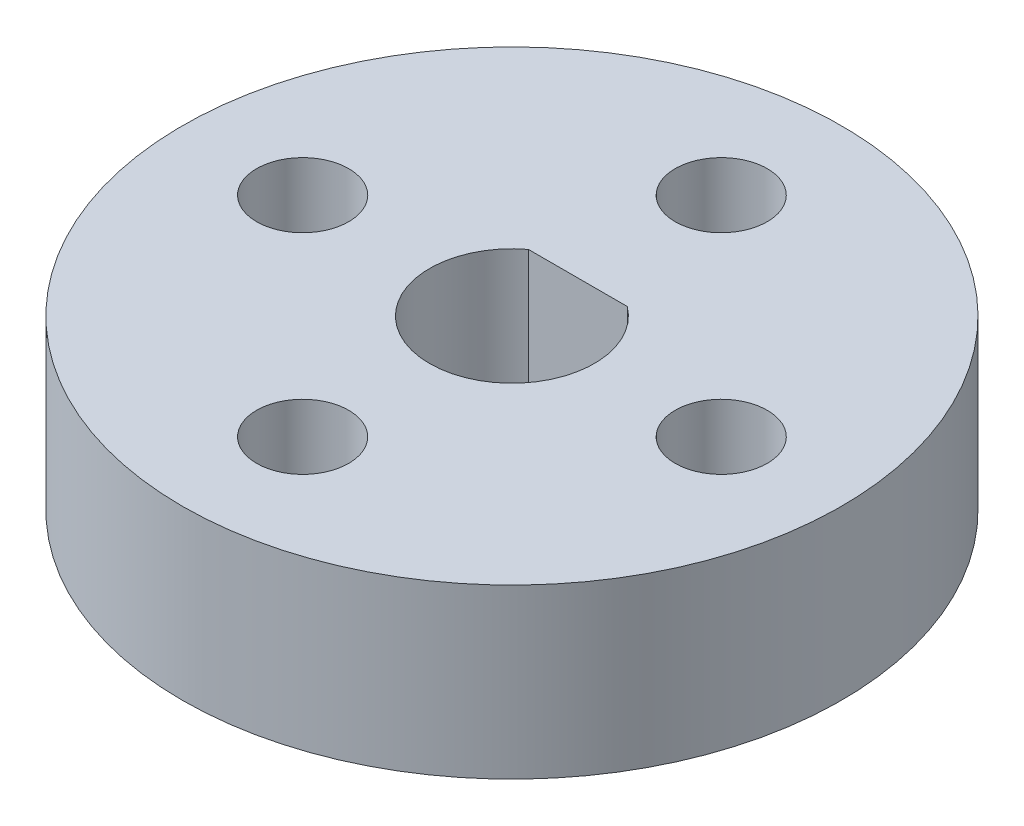
ISO-10303-21;
HEADER;
FILE_DESCRIPTION(('STEP AP214'),'2;1');
FILE_NAME('part.step','',(''),(''),'','','');
FILE_SCHEMA(('AUTOMOTIVE_DESIGN { 1 0 10303 214 1 1 1 1 }'));
ENDSEC;
DATA;
#1=APPLICATION_CONTEXT('core data for automotive mechanical design processes');
#2=APPLICATION_PROTOCOL_DEFINITION('international standard','automotive_design',2000,#1);
#3=PRODUCT_CONTEXT('',#1,'mechanical');
#4=PRODUCT('Part','Part','',(#3));
#5=PRODUCT_RELATED_PRODUCT_CATEGORY('part','',(#4));
#6=PRODUCT_DEFINITION_FORMATION('','',#4);
#7=PRODUCT_DEFINITION_CONTEXT('part definition',#1,'design');
#8=PRODUCT_DEFINITION('design','',#6,#7);
#9=PRODUCT_DEFINITION_SHAPE('','',#8);
#10=(LENGTH_UNIT() NAMED_UNIT(*) SI_UNIT(.MILLI.,.METRE.));
#11=(NAMED_UNIT(*) PLANE_ANGLE_UNIT() SI_UNIT($,.RADIAN.));
#12=(NAMED_UNIT(*) SI_UNIT($,.STERADIAN.) SOLID_ANGLE_UNIT());
#13=UNCERTAINTY_MEASURE_WITH_UNIT(LENGTH_MEASURE(1.E-05),#10,'distance_accuracy_value','');
#14=(GEOMETRIC_REPRESENTATION_CONTEXT(3) GLOBAL_UNCERTAINTY_ASSIGNED_CONTEXT((#13)) GLOBAL_UNIT_ASSIGNED_CONTEXT((#10,
#11,#12)) REPRESENTATION_CONTEXT('',''));
#15=CARTESIAN_POINT('',(0.,0.,0.));
#16=DIRECTION('',(0.,0.,1.));
#17=DIRECTION('',(1.,0.,0.));
#18=AXIS2_PLACEMENT_3D('',#15,#16,#17);
#19=CARTESIAN_POINT('',(0.,5.1,-2.));
#20=DIRECTION('',(0.,0.,-1.));
#21=DIRECTION('',(-1.,0.,0.));
#22=AXIS2_PLACEMENT_3D('',#19,#20,#21);
#23=PLANE('',#22);
#24=DIRECTION('',(1.,0.,0.));
#25=VECTOR('',#24,1.);
#26=CARTESIAN_POINT('',(0.,0.,-2.));
#27=LINE('',#26,#25);
#28=CARTESIAN_POINT('',(-1.5,0.,-2.));
#29=VERTEX_POINT('',#28);
#30=CARTESIAN_POINT('',(1.5,0.,-2.));
#31=VERTEX_POINT('',#30);
#32=EDGE_CURVE('E59',#29,#31,#27,.T.);
#33=ORIENTED_EDGE('',*,*,#32,.T.);
#34=DIRECTION('',(0.,-1.,0.));
#35=VECTOR('',#34,1.);
#36=CARTESIAN_POINT('',(1.5,5.1,-2.));
#37=LINE('',#36,#35);
#38=CARTESIAN_POINT('',(1.5,5.1,-2.));
#39=VERTEX_POINT('',#38);
#40=EDGE_CURVE('E11',#39,#31,#37,.T.);
#41=ORIENTED_EDGE('',*,*,#40,.F.);
#42=DIRECTION('',(1.,0.,0.));
#43=VECTOR('',#42,1.);
#44=CARTESIAN_POINT('',(0.,5.1,-2.));
#45=LINE('',#44,#43);
#46=CARTESIAN_POINT('',(-1.5,5.1,-2.));
#47=VERTEX_POINT('',#46);
#48=EDGE_CURVE('E61',#47,#39,#45,.T.);
#49=ORIENTED_EDGE('',*,*,#48,.F.);
#50=DIRECTION('',(0.,-1.,0.));
#51=VECTOR('',#50,1.);
#52=CARTESIAN_POINT('',(-1.5,5.1,-2.));
#53=LINE('',#52,#51);
#54=EDGE_CURVE('E43',#47,#29,#53,.T.);
#55=ORIENTED_EDGE('',*,*,#54,.T.);
#56=EDGE_LOOP('',(#33,#41,#49,#55));
#57=FACE_BOUND('',#56,.T.);
#58=ADVANCED_FACE('F35',(#57),#23,.F.);
#59=CARTESIAN_POINT('',(0.,5.1,-6.35));
#60=DIRECTION('',(0.,-1.,0.));
#61=DIRECTION('',(0.,0.,-1.));
#62=AXIS2_PLACEMENT_3D('',#59,#60,#61);
#63=CYLINDRICAL_SURFACE('',#62,1.397);
#64=CARTESIAN_POINT('',(0.,5.1,-6.35));
#65=DIRECTION('',(0.,1.,0.));
#66=DIRECTION('',(0.,0.,1.));
#67=AXIS2_PLACEMENT_3D('',#64,#65,#66);
#68=CIRCLE('',#67,1.397);
#69=CARTESIAN_POINT('',(0.,5.1,-4.953));
#70=VERTEX_POINT('',#69);
#71=EDGE_CURVE('E103',#70,#70,#68,.T.);
#72=ORIENTED_EDGE('',*,*,#71,.T.);
#73=EDGE_LOOP('',(#72));
#74=FACE_BOUND('',#73,.T.);
#75=CARTESIAN_POINT('',(0.,0.,-6.35));
#76=DIRECTION('',(0.,1.,0.));
#77=DIRECTION('',(0.,0.,1.));
#78=AXIS2_PLACEMENT_3D('',#75,#76,#77);
#79=CIRCLE('',#78,1.397);
#80=CARTESIAN_POINT('',(0.,0.,-4.953));
#81=VERTEX_POINT('',#80);
#82=EDGE_CURVE('E82',#81,#81,#79,.T.);
#83=ORIENTED_EDGE('',*,*,#82,.F.);
#84=EDGE_LOOP('',(#83));
#85=FACE_BOUND('',#84,.T.);
#86=ADVANCED_FACE('F122',(#74,#85),#63,.F.);
#87=CARTESIAN_POINT('',(6.35000000000018,5.1,-1.79700204165607E-13));
#88=DIRECTION('',(0.,-1.,0.));
#89=DIRECTION('',(0.,0.,-1.));
#90=AXIS2_PLACEMENT_3D('',#87,#88,#89);
#91=CYLINDRICAL_SURFACE('',#90,1.397);
#92=CARTESIAN_POINT('',(6.35000000000018,5.1,-1.79700204165607E-13));
#93=DIRECTION('',(0.,1.,0.));
#94=DIRECTION('',(0.,0.,1.));
#95=AXIS2_PLACEMENT_3D('',#92,#93,#94);
#96=CIRCLE('',#95,1.397);
#97=CARTESIAN_POINT('',(6.35000000000018,5.1,1.39699999999982));
#98=VERTEX_POINT('',#97);
#99=EDGE_CURVE('E100',#98,#98,#96,.T.);
#100=ORIENTED_EDGE('',*,*,#99,.T.);
#101=EDGE_LOOP('',(#100));
#102=FACE_BOUND('',#101,.T.);
#103=CARTESIAN_POINT('',(6.35000000000018,0.,-1.79700204165607E-13));
#104=DIRECTION('',(0.,1.,0.));
#105=DIRECTION('',(0.,0.,1.));
#106=AXIS2_PLACEMENT_3D('',#103,#104,#105);
#107=CIRCLE('',#106,1.397);
#108=CARTESIAN_POINT('',(6.35000000000018,0.,1.39699999999982));
#109=VERTEX_POINT('',#108);
#110=EDGE_CURVE('E79',#109,#109,#107,.T.);
#111=ORIENTED_EDGE('',*,*,#110,.F.);
#112=EDGE_LOOP('',(#111));
#113=FACE_BOUND('',#112,.T.);
#114=ADVANCED_FACE('F126',(#102,#113),#91,.F.);
#115=CARTESIAN_POINT('',(3.59400408331214E-13,5.1,6.35));
#116=DIRECTION('',(0.,-1.,0.));
#117=DIRECTION('',(0.,0.,-1.));
#118=AXIS2_PLACEMENT_3D('',#115,#116,#117);
#119=CYLINDRICAL_SURFACE('',#118,1.397);
#120=CARTESIAN_POINT('',(3.59400408331214E-13,5.1,6.35));
#121=DIRECTION('',(0.,1.,0.));
#122=DIRECTION('',(0.,0.,1.));
#123=AXIS2_PLACEMENT_3D('',#120,#121,#122);
#124=CIRCLE('',#123,1.397);
#125=CARTESIAN_POINT('',(3.59400408331214E-13,5.1,7.747));
#126=VERTEX_POINT('',#125);
#127=EDGE_CURVE('E97',#126,#126,#124,.T.);
#128=ORIENTED_EDGE('',*,*,#127,.T.);
#129=EDGE_LOOP('',(#128));
#130=FACE_BOUND('',#129,.T.);
#131=CARTESIAN_POINT('',(3.59400408331214E-13,0.,6.35));
#132=DIRECTION('',(0.,1.,0.));
#133=DIRECTION('',(0.,0.,1.));
#134=AXIS2_PLACEMENT_3D('',#131,#132,#133);
#135=CIRCLE('',#134,1.397);
#136=CARTESIAN_POINT('',(3.59400408331214E-13,0.,7.747));
#137=VERTEX_POINT('',#136);
#138=EDGE_CURVE('E73',#137,#137,#135,.T.);
#139=ORIENTED_EDGE('',*,*,#138,.F.);
#140=EDGE_LOOP('',(#139));
#141=FACE_BOUND('',#140,.T.);
#142=ADVANCED_FACE('F131',(#130,#141),#119,.F.);
#143=CARTESIAN_POINT('',(-6.34999999999982,5.1,1.80477854883065E-13));
#144=DIRECTION('',(0.,-1.,0.));
#145=DIRECTION('',(0.,0.,-1.));
#146=AXIS2_PLACEMENT_3D('',#143,#144,#145);
#147=CYLINDRICAL_SURFACE('',#146,1.397);
#148=CARTESIAN_POINT('',(-6.34999999999982,5.1,1.80477854883065E-13));
#149=DIRECTION('',(0.,1.,0.));
#150=DIRECTION('',(0.,0.,1.));
#151=AXIS2_PLACEMENT_3D('',#148,#149,#150);
#152=CIRCLE('',#151,1.397);
#153=CARTESIAN_POINT('',(-6.34999999999982,5.1,1.39700000000018));
#154=VERTEX_POINT('',#153);
#155=EDGE_CURVE('E92',#154,#154,#152,.T.);
#156=ORIENTED_EDGE('',*,*,#155,.T.);
#157=EDGE_LOOP('',(#156));
#158=FACE_BOUND('',#157,.T.);
#159=CARTESIAN_POINT('',(-6.34999999999982,0.,1.80477854883065E-13));
#160=DIRECTION('',(0.,1.,0.));
#161=DIRECTION('',(0.,0.,1.));
#162=AXIS2_PLACEMENT_3D('',#159,#160,#161);
#163=CIRCLE('',#162,1.397);
#164=CARTESIAN_POINT('',(-6.34999999999982,0.,1.39700000000018));
#165=VERTEX_POINT('',#164);
#166=EDGE_CURVE('E70',#165,#165,#163,.T.);
#167=ORIENTED_EDGE('',*,*,#166,.F.);
#168=EDGE_LOOP('',(#167));
#169=FACE_BOUND('',#168,.T.);
#170=ADVANCED_FACE('F118',(#158,#169),#147,.F.);
#171=CARTESIAN_POINT('',(0.,5.1,0.));
#172=DIRECTION('',(0.,-1.,0.));
#173=DIRECTION('',(0.,0.,-1.));
#174=AXIS2_PLACEMENT_3D('',#171,#172,#173);
#175=CYLINDRICAL_SURFACE('',#174,2.5);
#176=CARTESIAN_POINT('',(0.,0.,0.));
#177=DIRECTION('',(0.,1.,0.));
#178=DIRECTION('',(0.,0.,1.));
#179=AXIS2_PLACEMENT_3D('',#176,#177,#178);
#180=CIRCLE('',#179,2.5);
#181=EDGE_CURVE('E67',#29,#31,#180,.T.);
#182=ORIENTED_EDGE('',*,*,#181,.F.);
#183=ORIENTED_EDGE('',*,*,#54,.F.);
#184=CARTESIAN_POINT('',(0.,5.1,0.));
#185=DIRECTION('',(0.,1.,0.));
#186=DIRECTION('',(0.,0.,1.));
#187=AXIS2_PLACEMENT_3D('',#184,#185,#186);
#188=CIRCLE('',#187,2.5);
#189=EDGE_CURVE('E89',#47,#39,#188,.T.);
#190=ORIENTED_EDGE('',*,*,#189,.T.);
#191=ORIENTED_EDGE('',*,*,#40,.T.);
#192=EDGE_LOOP('',(#182,#183,#190,#191));
#193=FACE_BOUND('',#192,.T.);
#194=ADVANCED_FACE('F69',(#193),#175,.F.);
#195=CARTESIAN_POINT('',(0.,5.1,0.));
#196=DIRECTION('',(0.,-1.,0.));
#197=DIRECTION('',(0.,0.,-1.));
#198=AXIS2_PLACEMENT_3D('',#195,#196,#197);
#199=CYLINDRICAL_SURFACE('',#198,10.);
#200=CARTESIAN_POINT('',(0.,5.1,0.));
#201=DIRECTION('',(0.,1.,0.));
#202=DIRECTION('',(0.,0.,1.));
#203=AXIS2_PLACEMENT_3D('',#200,#201,#202);
#204=CIRCLE('',#203,10.);
#205=CARTESIAN_POINT('',(0.,5.1,10.));
#206=VERTEX_POINT('',#205);
#207=EDGE_CURVE('E63',#206,#206,#204,.T.);
#208=ORIENTED_EDGE('',*,*,#207,.F.);
#209=EDGE_LOOP('',(#208));
#210=FACE_BOUND('',#209,.T.);
#211=CARTESIAN_POINT('',(0.,0.,0.));
#212=DIRECTION('',(0.,1.,0.));
#213=DIRECTION('',(0.,0.,1.));
#214=AXIS2_PLACEMENT_3D('',#211,#212,#213);
#215=CIRCLE('',#214,10.);
#216=CARTESIAN_POINT('',(0.,0.,10.));
#217=VERTEX_POINT('',#216);
#218=EDGE_CURVE('E85',#217,#217,#215,.T.);
#219=ORIENTED_EDGE('',*,*,#218,.T.);
#220=EDGE_LOOP('',(#219));
#221=FACE_BOUND('',#220,.T.);
#222=ADVANCED_FACE('F110',(#210,#221),#199,.T.);
#223=CARTESIAN_POINT('',(0.,5.1,0.));
#224=DIRECTION('',(0.,1.,0.));
#225=DIRECTION('',(0.,0.,1.));
#226=AXIS2_PLACEMENT_3D('',#223,#224,#225);
#227=PLANE('',#226);
#228=ORIENTED_EDGE('',*,*,#48,.T.);
#229=ORIENTED_EDGE('',*,*,#189,.F.);
#230=EDGE_LOOP('',(#228,#229));
#231=FACE_BOUND('',#230,.T.);
#232=ORIENTED_EDGE('',*,*,#155,.F.);
#233=EDGE_LOOP('',(#232));
#234=FACE_BOUND('',#233,.T.);
#235=ORIENTED_EDGE('',*,*,#127,.F.);
#236=EDGE_LOOP('',(#235));
#237=FACE_BOUND('',#236,.T.);
#238=ORIENTED_EDGE('',*,*,#99,.F.);
#239=EDGE_LOOP('',(#238));
#240=FACE_BOUND('',#239,.T.);
#241=ORIENTED_EDGE('',*,*,#71,.F.);
#242=EDGE_LOOP('',(#241));
#243=FACE_BOUND('',#242,.T.);
#244=ORIENTED_EDGE('',*,*,#207,.T.);
#245=EDGE_LOOP('',(#244));
#246=FACE_BOUND('',#245,.T.);
#247=ADVANCED_FACE('F108',(#231,#234,#237,#240,#243,#246),#227,.T.);
#248=CARTESIAN_POINT('',(0.,0.,0.));
#249=DIRECTION('',(0.,1.,0.));
#250=DIRECTION('',(0.,0.,1.));
#251=AXIS2_PLACEMENT_3D('',#248,#249,#250);
#252=PLANE('',#251);
#253=ORIENTED_EDGE('',*,*,#32,.F.);
#254=ORIENTED_EDGE('',*,*,#181,.T.);
#255=EDGE_LOOP('',(#253,#254));
#256=FACE_BOUND('',#255,.T.);
#257=ORIENTED_EDGE('',*,*,#166,.T.);
#258=EDGE_LOOP('',(#257));
#259=FACE_BOUND('',#258,.T.);
#260=ORIENTED_EDGE('',*,*,#138,.T.);
#261=EDGE_LOOP('',(#260));
#262=FACE_BOUND('',#261,.T.);
#263=ORIENTED_EDGE('',*,*,#110,.T.);
#264=EDGE_LOOP('',(#263));
#265=FACE_BOUND('',#264,.T.);
#266=ORIENTED_EDGE('',*,*,#82,.T.);
#267=EDGE_LOOP('',(#266));
#268=FACE_BOUND('',#267,.T.);
#269=ORIENTED_EDGE('',*,*,#218,.F.);
#270=EDGE_LOOP('',(#269));
#271=FACE_BOUND('',#270,.T.);
#272=ADVANCED_FACE('F65',(#256,#259,#262,#265,#268,#271),#252,.F.);
#273=CLOSED_SHELL('',(#58,#86,#114,#142,#170,#194,#222,#247,#272));
#274=MANIFOLD_SOLID_BREP('B2',#273);
#275=ADVANCED_BREP_SHAPE_REPRESENTATION('',(#18,#274),#14);
#276=SHAPE_DEFINITION_REPRESENTATION(#9,#275);
ENDSEC;
END-ISO-10303-21;
